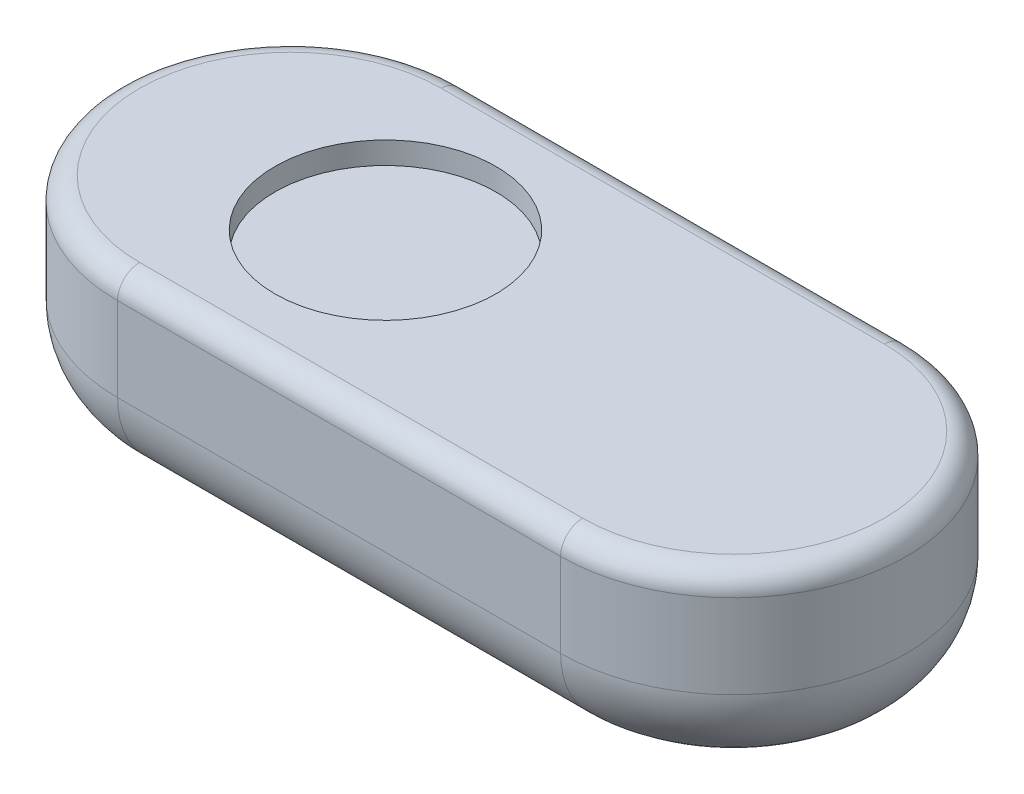
ISO-10303-21;
HEADER;
FILE_DESCRIPTION(('STEP AP214'),'2;1');
FILE_NAME('part.step','',(''),(''),'','','');
FILE_SCHEMA(('AUTOMOTIVE_DESIGN { 1 0 10303 214 1 1 1 1 }'));
ENDSEC;
DATA;
#1=APPLICATION_CONTEXT('core data for automotive mechanical design processes');
#2=APPLICATION_PROTOCOL_DEFINITION('international standard','automotive_design',2000,#1);
#3=PRODUCT_CONTEXT('',#1,'mechanical');
#4=PRODUCT('Part','Part','',(#3));
#5=PRODUCT_RELATED_PRODUCT_CATEGORY('part','',(#4));
#6=PRODUCT_DEFINITION_FORMATION('','',#4);
#7=PRODUCT_DEFINITION_CONTEXT('part definition',#1,'design');
#8=PRODUCT_DEFINITION('design','',#6,#7);
#9=PRODUCT_DEFINITION_SHAPE('','',#8);
#10=(LENGTH_UNIT() NAMED_UNIT(*) SI_UNIT(.MILLI.,.METRE.));
#11=(NAMED_UNIT(*) PLANE_ANGLE_UNIT() SI_UNIT($,.RADIAN.));
#12=(NAMED_UNIT(*) SI_UNIT($,.STERADIAN.) SOLID_ANGLE_UNIT());
#13=UNCERTAINTY_MEASURE_WITH_UNIT(LENGTH_MEASURE(1.E-05),#10,'distance_accuracy_value','');
#14=(GEOMETRIC_REPRESENTATION_CONTEXT(3) GLOBAL_UNCERTAINTY_ASSIGNED_CONTEXT((#13)) GLOBAL_UNIT_ASSIGNED_CONTEXT((#10,
#11,#12)) REPRESENTATION_CONTEXT('',''));
#15=CARTESIAN_POINT('',(0.,0.,0.));
#16=DIRECTION('',(0.,0.,1.));
#17=DIRECTION('',(1.,0.,0.));
#18=AXIS2_PLACEMENT_3D('',#15,#16,#17);
#19=CARTESIAN_POINT('',(-20.05,17.6,0.));
#20=DIRECTION('',(0.,-1.,0.));
#21=DIRECTION('',(0.,0.,-1.));
#22=AXIS2_PLACEMENT_3D('',#19,#20,#21);
#23=CYLINDRICAL_SURFACE('',#22,15.65);
#24=DIRECTION('',(0.,-1.,0.));
#25=VECTOR('',#24,1.);
#26=CARTESIAN_POINT('',(-20.05,17.6,-15.65));
#27=LINE('',#26,#25);
#28=CARTESIAN_POINT('',(-20.05,15.6,-15.65));
#29=VERTEX_POINT('',#28);
#30=CARTESIAN_POINT('',(-20.05,8.,-15.65));
#31=VERTEX_POINT('',#30);
#32=EDGE_CURVE('E120',#29,#31,#27,.T.);
#33=ORIENTED_EDGE('',*,*,#32,.T.);
#34=CARTESIAN_POINT('',(-20.05,8.,0.));
#35=DIRECTION('',(0.,1.,0.));
#36=DIRECTION('',(0.,0.,1.));
#37=AXIS2_PLACEMENT_3D('',#34,#35,#36);
#38=CIRCLE('',#37,15.65);
#39=CARTESIAN_POINT('',(-20.05,8.,15.65));
#40=VERTEX_POINT('',#39);
#41=EDGE_CURVE('E11',#31,#40,#38,.T.);
#42=ORIENTED_EDGE('',*,*,#41,.T.);
#43=DIRECTION('',(0.,-1.,0.));
#44=VECTOR('',#43,1.);
#45=CARTESIAN_POINT('',(-20.05,17.6,15.65));
#46=LINE('',#45,#44);
#47=CARTESIAN_POINT('',(-20.05,15.6,15.65));
#48=VERTEX_POINT('',#47);
#49=EDGE_CURVE('E126',#48,#40,#46,.T.);
#50=ORIENTED_EDGE('',*,*,#49,.F.);
#51=CARTESIAN_POINT('',(-20.05,15.6,0.));
#52=DIRECTION('',(0.,1.,0.));
#53=DIRECTION('',(0.,0.,1.));
#54=AXIS2_PLACEMENT_3D('',#51,#52,#53);
#55=CIRCLE('',#54,15.65);
#56=EDGE_CURVE('E136',#48,#29,#55,.F.);
#57=ORIENTED_EDGE('',*,*,#56,.T.);
#58=EDGE_LOOP('',(#33,#42,#50,#57));
#59=FACE_BOUND('',#58,.T.);
#60=ADVANCED_FACE('F33',(#59),#23,.T.);
#61=CARTESIAN_POINT('',(-20.05,17.6,15.65));
#62=DIRECTION('',(0.,0.,-1.));
#63=DIRECTION('',(-1.,0.,0.));
#64=AXIS2_PLACEMENT_3D('',#61,#62,#63);
#65=PLANE('',#64);
#66=ORIENTED_EDGE('',*,*,#49,.T.);
#67=DIRECTION('',(1.,0.,0.));
#68=VECTOR('',#67,1.);
#69=CARTESIAN_POINT('',(-20.05,8.,15.65));
#70=LINE('',#69,#68);
#71=CARTESIAN_POINT('',(20.05,8.,15.65));
#72=VERTEX_POINT('',#71);
#73=EDGE_CURVE('E144',#40,#72,#70,.T.);
#74=ORIENTED_EDGE('',*,*,#73,.T.);
#75=DIRECTION('',(0.,-1.,0.));
#76=VECTOR('',#75,1.);
#77=CARTESIAN_POINT('',(20.05,17.6,15.65));
#78=LINE('',#77,#76);
#79=CARTESIAN_POINT('',(20.05,15.6,15.65));
#80=VERTEX_POINT('',#79);
#81=EDGE_CURVE('E129',#80,#72,#78,.T.);
#82=ORIENTED_EDGE('',*,*,#81,.F.);
#83=DIRECTION('',(1.,0.,0.));
#84=VECTOR('',#83,1.);
#85=CARTESIAN_POINT('',(-20.05,15.6,15.65));
#86=LINE('',#85,#84);
#87=EDGE_CURVE('E139',#80,#48,#86,.F.);
#88=ORIENTED_EDGE('',*,*,#87,.T.);
#89=EDGE_LOOP('',(#66,#74,#82,#88));
#90=FACE_BOUND('',#89,.T.);
#91=ADVANCED_FACE('F190',(#90),#65,.F.);
#92=CARTESIAN_POINT('',(20.05,17.6,0.));
#93=DIRECTION('',(0.,-1.,0.));
#94=DIRECTION('',(0.,0.,-1.));
#95=AXIS2_PLACEMENT_3D('',#92,#93,#94);
#96=CYLINDRICAL_SURFACE('',#95,15.65);
#97=ORIENTED_EDGE('',*,*,#81,.T.);
#98=CARTESIAN_POINT('',(20.05,8.,0.));
#99=DIRECTION('',(0.,1.,0.));
#100=DIRECTION('',(0.,0.,1.));
#101=AXIS2_PLACEMENT_3D('',#98,#99,#100);
#102=CIRCLE('',#101,15.65);
#103=CARTESIAN_POINT('',(20.05,8.,-15.65));
#104=VERTEX_POINT('',#103);
#105=EDGE_CURVE('E57',#72,#104,#102,.T.);
#106=ORIENTED_EDGE('',*,*,#105,.T.);
#107=DIRECTION('',(0.,-1.,0.));
#108=VECTOR('',#107,1.);
#109=CARTESIAN_POINT('',(20.05,17.6,-15.65));
#110=LINE('',#109,#108);
#111=CARTESIAN_POINT('',(20.05,15.6,-15.65));
#112=VERTEX_POINT('',#111);
#113=EDGE_CURVE('E193',#112,#104,#110,.T.);
#114=ORIENTED_EDGE('',*,*,#113,.F.);
#115=CARTESIAN_POINT('',(20.05,15.6,0.));
#116=DIRECTION('',(0.,1.,0.));
#117=DIRECTION('',(0.,0.,1.));
#118=AXIS2_PLACEMENT_3D('',#115,#116,#117);
#119=CIRCLE('',#118,15.65);
#120=EDGE_CURVE('E117',#112,#80,#119,.F.);
#121=ORIENTED_EDGE('',*,*,#120,.T.);
#122=EDGE_LOOP('',(#97,#106,#114,#121));
#123=FACE_BOUND('',#122,.T.);
#124=ADVANCED_FACE('F192',(#123),#96,.T.);
#125=CARTESIAN_POINT('',(-20.05,17.6,-15.65));
#126=DIRECTION('',(0.,0.,-1.));
#127=DIRECTION('',(-1.,0.,0.));
#128=AXIS2_PLACEMENT_3D('',#125,#126,#127);
#129=PLANE('',#128);
#130=ORIENTED_EDGE('',*,*,#113,.T.);
#131=DIRECTION('',(1.,0.,0.));
#132=VECTOR('',#131,1.);
#133=CARTESIAN_POINT('',(-20.05,8.,-15.65));
#134=LINE('',#133,#132);
#135=EDGE_CURVE('E42',#104,#31,#134,.F.);
#136=ORIENTED_EDGE('',*,*,#135,.T.);
#137=ORIENTED_EDGE('',*,*,#32,.F.);
#138=DIRECTION('',(1.,0.,0.));
#139=VECTOR('',#138,1.);
#140=CARTESIAN_POINT('',(-20.05,15.6,-15.65));
#141=LINE('',#140,#139);
#142=EDGE_CURVE('E142',#29,#112,#141,.T.);
#143=ORIENTED_EDGE('',*,*,#142,.T.);
#144=EDGE_LOOP('',(#130,#136,#137,#143));
#145=FACE_BOUND('',#144,.T.);
#146=ADVANCED_FACE('F212',(#145),#129,.T.);
#147=CARTESIAN_POINT('',(-20.05,17.6,0.));
#148=DIRECTION('',(0.,1.,0.));
#149=DIRECTION('',(0.,0.,1.));
#150=AXIS2_PLACEMENT_3D('',#147,#148,#149);
#151=PLANE('',#150);
#152=CARTESIAN_POINT('',(-11.4554006267293,17.6,0.));
#153=DIRECTION('',(0.,1.,0.));
#154=DIRECTION('',(0.,0.,1.));
#155=AXIS2_PLACEMENT_3D('',#152,#153,#154);
#156=CIRCLE('',#155,10.);
#157=CARTESIAN_POINT('',(-11.4554006267293,17.6,10.));
#158=VERTEX_POINT('',#157);
#159=EDGE_CURVE('E197',#158,#158,#156,.T.);
#160=ORIENTED_EDGE('',*,*,#159,.F.);
#161=EDGE_LOOP('',(#160));
#162=FACE_BOUND('',#161,.T.);
#163=DIRECTION('',(1.,0.,0.));
#164=VECTOR('',#163,1.);
#165=CARTESIAN_POINT('',(-20.05,17.6,-13.65));
#166=LINE('',#165,#164);
#167=CARTESIAN_POINT('',(20.05,17.6,-13.65));
#168=VERTEX_POINT('',#167);
#169=CARTESIAN_POINT('',(-20.05,17.6,-13.65));
#170=VERTEX_POINT('',#169);
#171=EDGE_CURVE('E105',#168,#170,#166,.F.);
#172=ORIENTED_EDGE('',*,*,#171,.T.);
#173=CARTESIAN_POINT('',(-20.05,17.6,0.));
#174=DIRECTION('',(0.,1.,0.));
#175=DIRECTION('',(0.,0.,1.));
#176=AXIS2_PLACEMENT_3D('',#173,#174,#175);
#177=CIRCLE('',#176,13.65);
#178=CARTESIAN_POINT('',(-20.05,17.6,13.65));
#179=VERTEX_POINT('',#178);
#180=EDGE_CURVE('E134',#170,#179,#177,.T.);
#181=ORIENTED_EDGE('',*,*,#180,.T.);
#182=DIRECTION('',(1.,0.,0.));
#183=VECTOR('',#182,1.);
#184=CARTESIAN_POINT('',(20.05,17.6,13.65));
#185=LINE('',#184,#183);
#186=CARTESIAN_POINT('',(20.05,17.6,13.65));
#187=VERTEX_POINT('',#186);
#188=EDGE_CURVE('E108',#179,#187,#185,.T.);
#189=ORIENTED_EDGE('',*,*,#188,.T.);
#190=CARTESIAN_POINT('',(20.05,17.6,0.));
#191=DIRECTION('',(0.,1.,0.));
#192=DIRECTION('',(0.,0.,1.));
#193=AXIS2_PLACEMENT_3D('',#190,#191,#192);
#194=CIRCLE('',#193,13.65);
#195=EDGE_CURVE('E100',#187,#168,#194,.T.);
#196=ORIENTED_EDGE('',*,*,#195,.T.);
#197=EDGE_LOOP('',(#172,#181,#189,#196));
#198=FACE_BOUND('',#197,.T.);
#199=ADVANCED_FACE('F102',(#162,#198),#151,.T.);
#200=CARTESIAN_POINT('',(-20.05,0.,0.));
#201=DIRECTION('',(0.,1.,0.));
#202=DIRECTION('',(0.,0.,1.));
#203=AXIS2_PLACEMENT_3D('',#200,#201,#202);
#204=PLANE('',#203);
#205=CARTESIAN_POINT('',(20.05,0.,0.));
#206=DIRECTION('',(0.,1.,0.));
#207=DIRECTION('',(0.,0.,1.));
#208=AXIS2_PLACEMENT_3D('',#205,#206,#207);
#209=CIRCLE('',#208,7.65000000000001);
#210=CARTESIAN_POINT('',(20.05,0.,-7.65000000000001));
#211=VERTEX_POINT('',#210);
#212=CARTESIAN_POINT('',(20.05,0.,7.65000000000001));
#213=VERTEX_POINT('',#212);
#214=EDGE_CURVE('E155',#211,#213,#209,.F.);
#215=ORIENTED_EDGE('',*,*,#214,.T.);
#216=DIRECTION('',(1.,0.,0.));
#217=VECTOR('',#216,1.);
#218=CARTESIAN_POINT('',(-20.05,0.,7.65000000000001));
#219=LINE('',#218,#217);
#220=CARTESIAN_POINT('',(-20.05,0.,7.65000000000001));
#221=VERTEX_POINT('',#220);
#222=EDGE_CURVE('E157',#213,#221,#219,.F.);
#223=ORIENTED_EDGE('',*,*,#222,.T.);
#224=CARTESIAN_POINT('',(-20.05,0.,0.));
#225=DIRECTION('',(0.,1.,0.));
#226=DIRECTION('',(0.,0.,1.));
#227=AXIS2_PLACEMENT_3D('',#224,#225,#226);
#228=CIRCLE('',#227,7.65000000000001);
#229=CARTESIAN_POINT('',(-20.05,0.,-7.65));
#230=VERTEX_POINT('',#229);
#231=EDGE_CURVE('E151',#221,#230,#228,.F.);
#232=ORIENTED_EDGE('',*,*,#231,.T.);
#233=DIRECTION('',(1.,0.,0.));
#234=VECTOR('',#233,1.);
#235=CARTESIAN_POINT('',(20.05,0.,-7.65000000000001));
#236=LINE('',#235,#234);
#237=EDGE_CURVE('E153',#230,#211,#236,.T.);
#238=ORIENTED_EDGE('',*,*,#237,.T.);
#239=EDGE_LOOP('',(#215,#223,#232,#238));
#240=FACE_BOUND('',#239,.T.);
#241=ADVANCED_FACE('F181',(#240),#204,.F.);
#242=CARTESIAN_POINT('',(20.05,15.6,0.));
#243=DIRECTION('',(0.,1.,0.));
#244=DIRECTION('',(0.,0.,1.));
#245=AXIS2_PLACEMENT_3D('',#242,#243,#244);
#246=TOROIDAL_SURFACE('',#245,13.65,2.);
#247=CARTESIAN_POINT('',(20.05,15.6,13.65));
#248=DIRECTION('',(-1.,0.,0.));
#249=DIRECTION('',(0.,0.,1.));
#250=AXIS2_PLACEMENT_3D('',#247,#248,#249);
#251=CIRCLE('',#250,2.);
#252=EDGE_CURVE('E121',#80,#187,#251,.T.);
#253=ORIENTED_EDGE('',*,*,#252,.F.);
#254=ORIENTED_EDGE('',*,*,#120,.F.);
#255=CARTESIAN_POINT('',(20.05,15.6,-13.65));
#256=DIRECTION('',(-1.,0.,0.));
#257=DIRECTION('',(0.,0.,1.));
#258=AXIS2_PLACEMENT_3D('',#255,#256,#257);
#259=CIRCLE('',#258,2.);
#260=EDGE_CURVE('E115',#168,#112,#259,.T.);
#261=ORIENTED_EDGE('',*,*,#260,.F.);
#262=ORIENTED_EDGE('',*,*,#195,.F.);
#263=EDGE_LOOP('',(#253,#254,#261,#262));
#264=FACE_BOUND('',#263,.T.);
#265=ADVANCED_FACE('F116',(#264),#246,.T.);
#266=CARTESIAN_POINT('',(-20.05,15.6,-13.65));
#267=DIRECTION('',(1.,0.,0.));
#268=DIRECTION('',(0.,0.,-1.));
#269=AXIS2_PLACEMENT_3D('',#266,#267,#268);
#270=CYLINDRICAL_SURFACE('',#269,2.);
#271=ORIENTED_EDGE('',*,*,#260,.T.);
#272=ORIENTED_EDGE('',*,*,#142,.F.);
#273=CARTESIAN_POINT('',(-20.05,15.6,-13.65));
#274=DIRECTION('',(-1.,0.,0.));
#275=DIRECTION('',(0.,0.,1.));
#276=AXIS2_PLACEMENT_3D('',#273,#274,#275);
#277=CIRCLE('',#276,2.);
#278=EDGE_CURVE('E124',#170,#29,#277,.T.);
#279=ORIENTED_EDGE('',*,*,#278,.F.);
#280=ORIENTED_EDGE('',*,*,#171,.F.);
#281=EDGE_LOOP('',(#271,#272,#279,#280));
#282=FACE_BOUND('',#281,.T.);
#283=ADVANCED_FACE('F123',(#282),#270,.T.);
#284=CARTESIAN_POINT('',(-20.05,15.6,13.65));
#285=DIRECTION('',(-1.,0.,0.));
#286=DIRECTION('',(0.,0.,1.));
#287=AXIS2_PLACEMENT_3D('',#284,#285,#286);
#288=CYLINDRICAL_SURFACE('',#287,2.);
#289=ORIENTED_EDGE('',*,*,#252,.T.);
#290=ORIENTED_EDGE('',*,*,#188,.F.);
#291=CARTESIAN_POINT('',(-20.05,15.6,13.65));
#292=DIRECTION('',(-1.,0.,0.));
#293=DIRECTION('',(0.,0.,1.));
#294=AXIS2_PLACEMENT_3D('',#291,#292,#293);
#295=CIRCLE('',#294,2.);
#296=EDGE_CURVE('E145',#48,#179,#295,.T.);
#297=ORIENTED_EDGE('',*,*,#296,.F.);
#298=ORIENTED_EDGE('',*,*,#87,.F.);
#299=EDGE_LOOP('',(#289,#290,#297,#298));
#300=FACE_BOUND('',#299,.T.);
#301=ADVANCED_FACE('F232',(#300),#288,.T.);
#302=CARTESIAN_POINT('',(-20.05,15.6,0.));
#303=DIRECTION('',(0.,1.,0.));
#304=DIRECTION('',(0.,0.,1.));
#305=AXIS2_PLACEMENT_3D('',#302,#303,#304);
#306=TOROIDAL_SURFACE('',#305,13.65,2.);
#307=ORIENTED_EDGE('',*,*,#278,.T.);
#308=ORIENTED_EDGE('',*,*,#56,.F.);
#309=ORIENTED_EDGE('',*,*,#296,.T.);
#310=ORIENTED_EDGE('',*,*,#180,.F.);
#311=EDGE_LOOP('',(#307,#308,#309,#310));
#312=FACE_BOUND('',#311,.T.);
#313=ADVANCED_FACE('F229',(#312),#306,.T.);
#314=CARTESIAN_POINT('',(-20.05,8.,-7.65000000000001));
#315=DIRECTION('',(-1.,0.,0.));
#316=DIRECTION('',(0.,0.,1.));
#317=AXIS2_PLACEMENT_3D('',#314,#315,#316);
#318=CYLINDRICAL_SURFACE('',#317,8.);
#319=CARTESIAN_POINT('',(20.05,8.,-7.65000000000001));
#320=DIRECTION('',(1.,0.,0.));
#321=DIRECTION('',(0.,0.,-1.));
#322=AXIS2_PLACEMENT_3D('',#319,#320,#321);
#323=CIRCLE('',#322,8.);
#324=EDGE_CURVE('E166',#211,#104,#323,.T.);
#325=ORIENTED_EDGE('',*,*,#324,.F.);
#326=ORIENTED_EDGE('',*,*,#237,.F.);
#327=CARTESIAN_POINT('',(-20.05,8.,-7.65000000000001));
#328=DIRECTION('',(-1.,0.,0.));
#329=DIRECTION('',(0.,0.,1.));
#330=AXIS2_PLACEMENT_3D('',#327,#328,#329);
#331=CIRCLE('',#330,8.);
#332=EDGE_CURVE('E37',#31,#230,#331,.T.);
#333=ORIENTED_EDGE('',*,*,#332,.F.);
#334=ORIENTED_EDGE('',*,*,#135,.F.);
#335=EDGE_LOOP('',(#325,#326,#333,#334));
#336=FACE_BOUND('',#335,.T.);
#337=ADVANCED_FACE('F35',(#336),#318,.T.);
#338=CARTESIAN_POINT('',(-20.05,8.,0.));
#339=DIRECTION('',(0.,1.,0.));
#340=DIRECTION('',(0.,0.,1.));
#341=AXIS2_PLACEMENT_3D('',#338,#339,#340);
#342=DEGENERATE_TOROIDAL_SURFACE('',#341,7.65000000000001,8.,.T.);
#343=ORIENTED_EDGE('',*,*,#332,.T.);
#344=ORIENTED_EDGE('',*,*,#231,.F.);
#345=CARTESIAN_POINT('',(-20.05,8.,7.65000000000001));
#346=DIRECTION('',(1.,0.,0.));
#347=DIRECTION('',(0.,0.,-1.));
#348=AXIS2_PLACEMENT_3D('',#345,#346,#347);
#349=CIRCLE('',#348,8.);
#350=EDGE_CURVE('E164',#40,#221,#349,.T.);
#351=ORIENTED_EDGE('',*,*,#350,.F.);
#352=ORIENTED_EDGE('',*,*,#41,.F.);
#353=EDGE_LOOP('',(#343,#344,#351,#352));
#354=FACE_BOUND('',#353,.T.);
#355=ADVANCED_FACE('F176',(#354),#342,.T.);
#356=CARTESIAN_POINT('',(20.05,8.,0.));
#357=DIRECTION('',(0.,1.,0.));
#358=DIRECTION('',(0.,0.,1.));
#359=AXIS2_PLACEMENT_3D('',#356,#357,#358);
#360=DEGENERATE_TOROIDAL_SURFACE('',#359,7.65000000000001,8.,.T.);
#361=ORIENTED_EDGE('',*,*,#324,.T.);
#362=ORIENTED_EDGE('',*,*,#105,.F.);
#363=CARTESIAN_POINT('',(20.05,8.,7.65000000000001));
#364=DIRECTION('',(-1.,0.,0.));
#365=DIRECTION('',(0.,0.,1.));
#366=AXIS2_PLACEMENT_3D('',#363,#364,#365);
#367=CIRCLE('',#366,8.);
#368=EDGE_CURVE('E162',#213,#72,#367,.T.);
#369=ORIENTED_EDGE('',*,*,#368,.F.);
#370=ORIENTED_EDGE('',*,*,#214,.F.);
#371=EDGE_LOOP('',(#361,#362,#369,#370));
#372=FACE_BOUND('',#371,.T.);
#373=ADVANCED_FACE('F187',(#372),#360,.T.);
#374=CARTESIAN_POINT('',(-20.05,8.,7.65000000000001));
#375=DIRECTION('',(1.,0.,0.));
#376=DIRECTION('',(0.,0.,-1.));
#377=AXIS2_PLACEMENT_3D('',#374,#375,#376);
#378=CYLINDRICAL_SURFACE('',#377,8.);
#379=ORIENTED_EDGE('',*,*,#350,.T.);
#380=ORIENTED_EDGE('',*,*,#222,.F.);
#381=ORIENTED_EDGE('',*,*,#368,.T.);
#382=ORIENTED_EDGE('',*,*,#73,.F.);
#383=EDGE_LOOP('',(#379,#380,#381,#382));
#384=FACE_BOUND('',#383,.T.);
#385=ADVANCED_FACE('F185',(#384),#378,.T.);
#386=CARTESIAN_POINT('',(-11.4554006267293,15.6,0.));
#387=DIRECTION('',(0.,1.,0.));
#388=DIRECTION('',(0.,0.,1.));
#389=AXIS2_PLACEMENT_3D('',#386,#387,#388);
#390=CYLINDRICAL_SURFACE('',#389,10.);
#391=CARTESIAN_POINT('',(-11.4554006267293,15.6,0.));
#392=DIRECTION('',(0.,1.,0.));
#393=DIRECTION('',(0.,0.,1.));
#394=AXIS2_PLACEMENT_3D('',#391,#392,#393);
#395=CIRCLE('',#394,10.);
#396=CARTESIAN_POINT('',(-11.4554006267293,15.6,10.));
#397=VERTEX_POINT('',#396);
#398=EDGE_CURVE('E165',#397,#397,#395,.T.);
#399=ORIENTED_EDGE('',*,*,#398,.F.);
#400=EDGE_LOOP('',(#399));
#401=FACE_BOUND('',#400,.T.);
#402=ORIENTED_EDGE('',*,*,#159,.T.);
#403=EDGE_LOOP('',(#402));
#404=FACE_BOUND('',#403,.T.);
#405=ADVANCED_FACE('F205',(#401,#404),#390,.F.);
#406=CARTESIAN_POINT('',(-11.4554006267293,15.6,0.));
#407=DIRECTION('',(0.,1.,0.));
#408=DIRECTION('',(0.,0.,1.));
#409=AXIS2_PLACEMENT_3D('',#406,#407,#408);
#410=PLANE('',#409);
#411=ORIENTED_EDGE('',*,*,#398,.T.);
#412=EDGE_LOOP('',(#411));
#413=FACE_BOUND('',#412,.T.);
#414=ADVANCED_FACE('F203',(#413),#410,.T.);
#415=CLOSED_SHELL('',(#60,#91,#124,#146,#199,#241,#265,#283,#301,#313,#337,#355,#373,#385,#405,#414));
#416=MANIFOLD_SOLID_BREP('B2',#415);
#417=ADVANCED_BREP_SHAPE_REPRESENTATION('',(#18,#416),#14);
#418=SHAPE_DEFINITION_REPRESENTATION(#9,#417);
ENDSEC;
END-ISO-10303-21;
